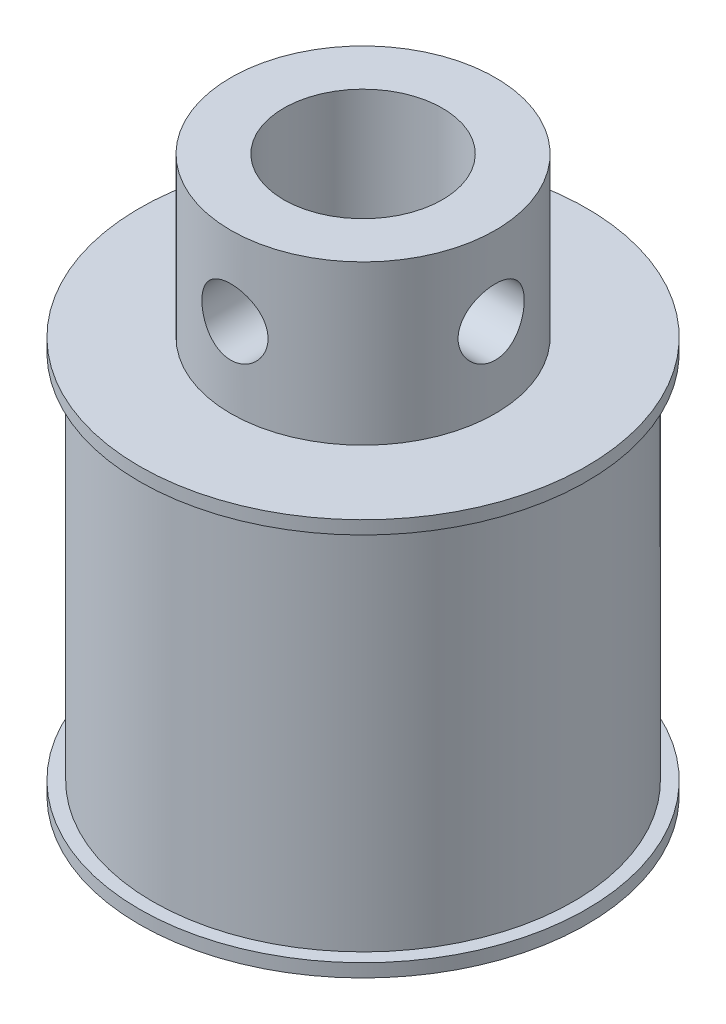
ISO-10303-21;
HEADER;
FILE_DESCRIPTION(('STEP AP214'),'2;1');
FILE_NAME('part.step','',(''),(''),'','','');
FILE_SCHEMA(('AUTOMOTIVE_DESIGN { 1 0 10303 214 1 1 1 1 }'));
ENDSEC;
DATA;
#1=APPLICATION_CONTEXT('core data for automotive mechanical design processes');
#2=APPLICATION_PROTOCOL_DEFINITION('international standard','automotive_design',2000,#1);
#3=PRODUCT_CONTEXT('',#1,'mechanical');
#4=PRODUCT('Part','Part','',(#3));
#5=PRODUCT_RELATED_PRODUCT_CATEGORY('part','',(#4));
#6=PRODUCT_DEFINITION_FORMATION('','',#4);
#7=PRODUCT_DEFINITION_CONTEXT('part definition',#1,'design');
#8=PRODUCT_DEFINITION('design','',#6,#7);
#9=PRODUCT_DEFINITION_SHAPE('','',#8);
#10=(LENGTH_UNIT() NAMED_UNIT(*) SI_UNIT(.MILLI.,.METRE.));
#11=(NAMED_UNIT(*) PLANE_ANGLE_UNIT() SI_UNIT($,.RADIAN.));
#12=(NAMED_UNIT(*) SI_UNIT($,.STERADIAN.) SOLID_ANGLE_UNIT());
#13=UNCERTAINTY_MEASURE_WITH_UNIT(LENGTH_MEASURE(1.E-05),#10,'distance_accuracy_value','');
#14=(GEOMETRIC_REPRESENTATION_CONTEXT(3) GLOBAL_UNCERTAINTY_ASSIGNED_CONTEXT((#13)) GLOBAL_UNIT_ASSIGNED_CONTEXT((#10,
#11,#12)) REPRESENTATION_CONTEXT('',''));
#15=CARTESIAN_POINT('',(0.,0.,0.));
#16=DIRECTION('',(0.,0.,1.));
#17=DIRECTION('',(1.,0.,0.));
#18=AXIS2_PLACEMENT_3D('',#15,#16,#17);
#19=CARTESIAN_POINT('',(0.,7.5,0.));
#20=DIRECTION('',(0.,-1.,0.));
#21=DIRECTION('',(0.,0.,-1.));
#22=AXIS2_PLACEMENT_3D('',#19,#20,#21);
#23=CYLINDRICAL_SURFACE('',#22,7.95);
#24=CARTESIAN_POINT('',(0.,-7.,0.));
#25=DIRECTION('',(0.,1.,0.));
#26=DIRECTION('',(0.,0.,1.));
#27=AXIS2_PLACEMENT_3D('',#24,#25,#26);
#28=CIRCLE('',#27,7.95);
#29=CARTESIAN_POINT('',(0.,-7.,7.95));
#30=VERTEX_POINT('',#29);
#31=EDGE_CURVE('E81',#30,#30,#28,.T.);
#32=ORIENTED_EDGE('',*,*,#31,.T.);
#33=EDGE_LOOP('',(#32));
#34=FACE_BOUND('',#33,.T.);
#35=CARTESIAN_POINT('',(0.,7.,0.));
#36=DIRECTION('',(0.,1.,0.));
#37=DIRECTION('',(0.,0.,1.));
#38=AXIS2_PLACEMENT_3D('',#35,#36,#37);
#39=CIRCLE('',#38,7.95);
#40=CARTESIAN_POINT('',(0.,7.,7.95));
#41=VERTEX_POINT('',#40);
#42=EDGE_CURVE('E12',#41,#41,#39,.T.);
#43=ORIENTED_EDGE('',*,*,#42,.F.);
#44=EDGE_LOOP('',(#43));
#45=FACE_BOUND('',#44,.T.);
#46=ADVANCED_FACE('F58',(#34,#45),#23,.T.);
#47=CARTESIAN_POINT('',(0.,7.,0.));
#48=DIRECTION('',(0.,1.,0.));
#49=DIRECTION('',(0.,0.,1.));
#50=AXIS2_PLACEMENT_3D('',#47,#48,#49);
#51=CYLINDRICAL_SURFACE('',#50,8.45);
#52=CARTESIAN_POINT('',(0.,7.,0.));
#53=DIRECTION('',(0.,1.,0.));
#54=DIRECTION('',(0.,0.,1.));
#55=AXIS2_PLACEMENT_3D('',#52,#53,#54);
#56=CIRCLE('',#55,8.45);
#57=CARTESIAN_POINT('',(0.,7.,8.45));
#58=VERTEX_POINT('',#57);
#59=EDGE_CURVE('E71',#58,#58,#56,.T.);
#60=ORIENTED_EDGE('',*,*,#59,.T.);
#61=EDGE_LOOP('',(#60));
#62=FACE_BOUND('',#61,.T.);
#63=CARTESIAN_POINT('',(0.,7.5,0.));
#64=DIRECTION('',(0.,1.,0.));
#65=DIRECTION('',(0.,0.,1.));
#66=AXIS2_PLACEMENT_3D('',#63,#64,#65);
#67=CIRCLE('',#66,8.45);
#68=CARTESIAN_POINT('',(0.,7.5,8.45));
#69=VERTEX_POINT('',#68);
#70=EDGE_CURVE('E78',#69,#69,#67,.T.);
#71=ORIENTED_EDGE('',*,*,#70,.F.);
#72=EDGE_LOOP('',(#71));
#73=FACE_BOUND('',#72,.T.);
#74=ADVANCED_FACE('F171',(#62,#73),#51,.T.);
#75=CARTESIAN_POINT('',(0.,7.,0.));
#76=DIRECTION('',(0.,1.,0.));
#77=DIRECTION('',(0.,0.,1.));
#78=AXIS2_PLACEMENT_3D('',#75,#76,#77);
#79=PLANE('',#78);
#80=ORIENTED_EDGE('',*,*,#42,.T.);
#81=EDGE_LOOP('',(#80));
#82=FACE_BOUND('',#81,.T.);
#83=ORIENTED_EDGE('',*,*,#59,.F.);
#84=EDGE_LOOP('',(#83));
#85=FACE_BOUND('',#84,.T.);
#86=ADVANCED_FACE('F168',(#82,#85),#79,.F.);
#87=CARTESIAN_POINT('',(0.,7.5,0.));
#88=DIRECTION('',(0.,1.,0.));
#89=DIRECTION('',(0.,0.,1.));
#90=AXIS2_PLACEMENT_3D('',#87,#88,#89);
#91=PLANE('',#90);
#92=CARTESIAN_POINT('',(0.,7.5,0.));
#93=DIRECTION('',(0.,1.,0.));
#94=DIRECTION('',(0.,0.,1.));
#95=AXIS2_PLACEMENT_3D('',#92,#93,#94);
#96=CIRCLE('',#95,5.);
#97=CARTESIAN_POINT('',(0.,7.5,5.));
#98=VERTEX_POINT('',#97);
#99=EDGE_CURVE('E99',#98,#98,#96,.F.);
#100=ORIENTED_EDGE('',*,*,#99,.T.);
#101=EDGE_LOOP('',(#100));
#102=FACE_BOUND('',#101,.T.);
#103=ORIENTED_EDGE('',*,*,#70,.T.);
#104=EDGE_LOOP('',(#103));
#105=FACE_BOUND('',#104,.T.);
#106=ADVANCED_FACE('F166',(#102,#105),#91,.T.);
#107=CARTESIAN_POINT('',(0.,-7.,0.));
#108=DIRECTION('',(0.,-1.,0.));
#109=DIRECTION('',(0.,0.,-1.));
#110=AXIS2_PLACEMENT_3D('',#107,#108,#109);
#111=CYLINDRICAL_SURFACE('',#110,8.45);
#112=CARTESIAN_POINT('',(0.,-7.,0.));
#113=DIRECTION('',(0.,1.,0.));
#114=DIRECTION('',(0.,0.,1.));
#115=AXIS2_PLACEMENT_3D('',#112,#113,#114);
#116=CIRCLE('',#115,8.45);
#117=CARTESIAN_POINT('',(0.,-7.,8.45));
#118=VERTEX_POINT('',#117);
#119=EDGE_CURVE('E84',#118,#118,#116,.T.);
#120=ORIENTED_EDGE('',*,*,#119,.F.);
#121=EDGE_LOOP('',(#120));
#122=FACE_BOUND('',#121,.T.);
#123=CARTESIAN_POINT('',(0.,-7.5,0.));
#124=DIRECTION('',(0.,1.,0.));
#125=DIRECTION('',(0.,0.,1.));
#126=AXIS2_PLACEMENT_3D('',#123,#124,#125);
#127=CIRCLE('',#126,8.45);
#128=CARTESIAN_POINT('',(0.,-7.5,8.45));
#129=VERTEX_POINT('',#128);
#130=EDGE_CURVE('E92',#129,#129,#127,.T.);
#131=ORIENTED_EDGE('',*,*,#130,.T.);
#132=EDGE_LOOP('',(#131));
#133=FACE_BOUND('',#132,.T.);
#134=ADVANCED_FACE('F162',(#122,#133),#111,.T.);
#135=CARTESIAN_POINT('',(0.,-7.,0.));
#136=DIRECTION('',(0.,1.,0.));
#137=DIRECTION('',(0.,0.,1.));
#138=AXIS2_PLACEMENT_3D('',#135,#136,#137);
#139=PLANE('',#138);
#140=ORIENTED_EDGE('',*,*,#31,.F.);
#141=EDGE_LOOP('',(#140));
#142=FACE_BOUND('',#141,.T.);
#143=ORIENTED_EDGE('',*,*,#119,.T.);
#144=EDGE_LOOP('',(#143));
#145=FACE_BOUND('',#144,.T.);
#146=ADVANCED_FACE('F159',(#142,#145),#139,.T.);
#147=CARTESIAN_POINT('',(0.,-7.5,0.));
#148=DIRECTION('',(0.,1.,0.));
#149=DIRECTION('',(0.,0.,1.));
#150=AXIS2_PLACEMENT_3D('',#147,#148,#149);
#151=PLANE('',#150);
#152=CARTESIAN_POINT('',(0.,-7.5,0.));
#153=DIRECTION('',(0.,1.,0.));
#154=DIRECTION('',(0.,0.,1.));
#155=AXIS2_PLACEMENT_3D('',#152,#153,#154);
#156=CIRCLE('',#155,3.);
#157=CARTESIAN_POINT('',(0.,-7.5,3.));
#158=VERTEX_POINT('',#157);
#159=EDGE_CURVE('E109',#158,#158,#156,.T.);
#160=ORIENTED_EDGE('',*,*,#159,.T.);
#161=EDGE_LOOP('',(#160));
#162=FACE_BOUND('',#161,.T.);
#163=ORIENTED_EDGE('',*,*,#130,.F.);
#164=EDGE_LOOP('',(#163));
#165=FACE_BOUND('',#164,.T.);
#166=ADVANCED_FACE('F157',(#162,#165),#151,.F.);
#167=CARTESIAN_POINT('',(0.,13.5,0.));
#168=DIRECTION('',(0.,-1.,0.));
#169=DIRECTION('',(0.,0.,-1.));
#170=AXIS2_PLACEMENT_3D('',#167,#168,#169);
#171=CYLINDRICAL_SURFACE('',#170,5.);
#172=CARTESIAN_POINT('',(-1.25,10.5,4.84122918275927));
#173=CARTESIAN_POINT('',(-1.24999803929589,10.5690253754623,4.84123050042654));
#174=CARTESIAN_POINT('',(-1.24426312274865,10.638072449339,4.84272153006957));
#175=CARTESIAN_POINT('',(-1.22151156273207,10.774183789087,4.84850930996624));
#176=CARTESIAN_POINT('',(-1.2044883533711,10.8412468772342,4.85280769310907));
#177=CARTESIAN_POINT('',(-1.15974559981597,10.9714017690935,4.86369362297984));
#178=CARTESIAN_POINT('',(-1.13203986392723,11.0344985776928,4.87027821345204));
#179=CARTESIAN_POINT('',(-1.0667605706307,11.15515542627,4.88499096014404));
#180=CARTESIAN_POINT('',(-1.02918659428034,11.2127152310401,4.89311918189251));
#181=CARTESIAN_POINT('',(-0.944354213655936,11.3219308226311,4.91020358177806));
#182=CARTESIAN_POINT('',(-0.896918443852023,11.373446800175,4.91917298811515));
#183=CARTESIAN_POINT('',(-0.794091032050331,11.4678806971802,4.93681437757649));
#184=CARTESIAN_POINT('',(-0.738698647090152,11.5107978128109,4.94548633283195));
#185=CARTESIAN_POINT('',(-0.620572600539475,11.5873877338156,4.96170207760291));
#186=CARTESIAN_POINT('',(-0.557747288097558,11.6209231940807,4.96922843700296));
#187=CARTESIAN_POINT('',(-0.427131592146379,11.6769048220765,4.98215405962992));
#188=CARTESIAN_POINT('',(-0.359341942895968,11.6993526259578,4.98755363667172));
#189=CARTESIAN_POINT('',(-0.222179379377079,11.7320739172893,4.9955237942409));
#190=CARTESIAN_POINT('',(-0.152866359774486,11.7425848221633,4.99814946922157));
#191=CARTESIAN_POINT('',(-0.0134144096313835,11.7518791896378,5.00046797053649));
#192=CARTESIAN_POINT('',(0.0567243972690353,11.7506643861048,5.00016123048352));
#193=CARTESIAN_POINT('',(0.194190308965485,11.7367125748749,4.99669047476767));
#194=CARTESIAN_POINT('',(0.261545269501334,11.7242318374731,4.99359001170437));
#195=CARTESIAN_POINT('',(0.393172809267108,11.6885143649758,4.98495418262427));
#196=CARTESIAN_POINT('',(0.457445224213048,11.6652770573113,4.9794186869922));
#197=CARTESIAN_POINT('',(0.581758379377258,11.6084987146565,4.96643754850448));
#198=CARTESIAN_POINT('',(0.64175563720813,11.5748664776691,4.95897509847527));
#199=CARTESIAN_POINT('',(0.75534452792561,11.4983221604419,4.94294951904824));
#200=CARTESIAN_POINT('',(0.808935043856881,11.4554084657197,4.93438619826245));
#201=CARTESIAN_POINT('',(0.909717543856194,11.3601456290088,4.9168185688476));
#202=CARTESIAN_POINT('',(0.956697098843998,11.3075725538261,4.90780859762959));
#203=CARTESIAN_POINT('',(1.04122046995377,11.1952000132299,4.89057521758353));
#204=CARTESIAN_POINT('',(1.07876384505752,11.1354002102545,4.88235184552985));
#205=CARTESIAN_POINT('',(1.14348516127825,11.0098549829255,4.86760248415824));
#206=CARTESIAN_POINT('',(1.17061195871311,10.9440821348434,4.8610849186286));
#207=CARTESIAN_POINT('',(1.21335702579542,10.8087072659618,4.85059320069978));
#208=CARTESIAN_POINT('',(1.22897775819114,10.7391060680084,4.84661850405109));
#209=CARTESIAN_POINT('',(1.24791481933259,10.6000202492384,4.8417767801957));
#210=CARTESIAN_POINT('',(1.25154523695981,10.5305811033352,4.84083044546824));
#211=CARTESIAN_POINT('',(1.24725849525777,10.3920890317109,4.8419367174052));
#212=CARTESIAN_POINT('',(1.2393423989244,10.3230360710244,4.84398904800633));
#213=CARTESIAN_POINT('',(1.21246273196883,10.1884428675226,4.8507854097728));
#214=CARTESIAN_POINT('',(1.19368203414087,10.1228636367146,4.85548485117188));
#215=CARTESIAN_POINT('',(1.14580904083531,9.99578427107416,4.86700359135481));
#216=CARTESIAN_POINT('',(1.11671552385627,9.93428462047233,4.87382314124307));
#217=CARTESIAN_POINT('',(1.04838533396828,9.81577936106633,4.88898068546631));
#218=CARTESIAN_POINT('',(1.00896087691781,9.75888557997845,4.89734584303321));
#219=CARTESIAN_POINT('',(0.921325366168068,9.65240581859933,4.91458541535858));
#220=CARTESIAN_POINT('',(0.873112868506798,9.60282104167497,4.92345991364235));
#221=CARTESIAN_POINT('',(0.767828401230906,9.51109447871453,4.94098701515803));
#222=CARTESIAN_POINT('',(0.71056494066449,9.4691699687256,4.94962851030918));
#223=CARTESIAN_POINT('',(0.589628353368343,9.39553206652438,4.96548608306867));
#224=CARTESIAN_POINT('',(0.525955561196988,9.3638181416959,4.9727022350198));
#225=CARTESIAN_POINT('',(0.394447752163861,9.31177698273604,4.98485057869157));
#226=CARTESIAN_POINT('',(0.32664672628485,9.29136785781047,4.98979915011205));
#227=CARTESIAN_POINT('',(0.188437200398509,9.26226983269579,4.99692646697894));
#228=CARTESIAN_POINT('',(0.118029206301553,9.25357867063048,4.99910574696704));
#229=CARTESIAN_POINT('',(-0.0213544080541589,9.24829051303059,5.00042711761014));
#230=CARTESIAN_POINT('',(-0.0903172837075423,9.25137286363077,4.9996497360001));
#231=CARTESIAN_POINT('',(-0.226709370518425,9.26880978411792,4.9953237057178));
#232=CARTESIAN_POINT('',(-0.294138627226109,9.28316401876638,4.99177513946369));
#233=CARTESIAN_POINT('',(-0.425213794556021,9.32256527471366,4.98231791067453));
#234=CARTESIAN_POINT('',(-0.488878118226275,9.34755431664328,4.97642205628333));
#235=CARTESIAN_POINT('',(-0.611146316301836,9.40746322377416,4.9628911114173));
#236=CARTESIAN_POINT('',(-0.669749551581315,9.44238434083696,4.9552558017217));
#237=CARTESIAN_POINT('',(-0.781752410529875,9.52214404249635,4.93884062101666));
#238=CARTESIAN_POINT('',(-0.83499373537573,9.56720017863423,4.93003771182014));
#239=CARTESIAN_POINT('',(-0.933268775339069,9.66552856496725,4.91238311316553));
#240=CARTESIAN_POINT('',(-0.978300406335237,9.71880289512239,4.90353141190695));
#241=CARTESIAN_POINT('',(-1.05970253309904,9.83325176775167,4.88659344825685));
#242=CARTESIAN_POINT('',(-1.09589577430819,9.89455515426579,4.87852454662356));
#243=CARTESIAN_POINT('',(-1.15740862076958,10.0225693624034,4.8642994443827));
#244=CARTESIAN_POINT('',(-1.18273613719965,10.0892762076334,4.85814185308378));
#245=CARTESIAN_POINT('',(-1.2180281607068,10.2132212647834,4.84939885924729));
#246=CARTESIAN_POINT('',(-1.22999146324422,10.2698664554798,4.84635828750683));
#247=CARTESIAN_POINT('',(-1.24597786571658,10.38433608625,4.84227298231965));
#248=CARTESIAN_POINT('',(-1.25000164296523,10.4421604253063,4.84122807862454));
#249=CARTESIAN_POINT('',(-1.25,10.5,4.84122918275927));
#250=B_SPLINE_CURVE_WITH_KNOTS('',3,(#172,#173,#174,#175,#176,#177,#178,#179,#180,#181,#182,
#183,#184,#185,#186,#187,#188,#189,#190,#191,#192,#193,#194,#195,#196,#197,#198,#199,#200,#201,
#202,#203,#204,#205,#206,#207,#208,#209,#210,#211,#212,#213,#214,#215,#216,#217,#218,#219,#220,
#221,#222,#223,#224,#225,#226,#227,#228,#229,#230,#231,#232,#233,#234,#235,#236,#237,#238,#239,
#240,#241,#242,#243,#244,#245,#246,#247,#248,#249),.UNSPECIFIED.,.T.,.F.,(4,2,2,2,2,2,2,2,2,2,2,
2,2,2,2,2,2,2,2,2,2,2,2,2,2,2,2,2,2,2,2,2,2,2,2,2,2,2,4),(0.,0.206863720868071,
0.413847870714333,0.620565363583009,0.827291633777393,1.03811977096488,1.24896760739933,
1.4627574819896,1.67651579923546,1.88594375497673,2.0953407433301,2.30009131344473,
2.50485278362393,2.71146437127222,2.91811192734456,3.13035233285956,3.34260265599901,
3.55588216004201,3.76911600064773,3.97671787380858,4.18430063591901,4.38848702504603,
4.59269760710708,4.80091422929578,5.00916509442522,5.22262665482659,5.43607707859776,
5.64796036403464,5.85980274454519,6.06591723063728,6.2720255868849,6.47702438279855,
6.68204902869036,6.89198548291035,7.10197515782754,7.31588238642338,7.52963360683309,
7.70298913588665,7.8763298754976),.UNSPECIFIED.);
#251=CARTESIAN_POINT('',(-1.25,10.5,4.84122918275927));
#252=VERTEX_POINT('',#251);
#253=EDGE_CURVE('E145',#252,#252,#250,.T.);
#254=ORIENTED_EDGE('',*,*,#253,.T.);
#255=EDGE_LOOP('',(#254));
#256=FACE_BOUND('',#255,.T.);
#257=CARTESIAN_POINT('',(4.84122918275927,10.5,1.24999999999999));
#258=CARTESIAN_POINT('',(4.84123050042654,10.5690253754623,1.24999803929588));
#259=CARTESIAN_POINT('',(4.84272153006957,10.638072449339,1.24426312274864));
#260=CARTESIAN_POINT('',(4.84850930996624,10.774183789087,1.22151156273206));
#261=CARTESIAN_POINT('',(4.85280769310907,10.8412468772342,1.20448835337109));
#262=CARTESIAN_POINT('',(4.86369362297984,10.9714017690935,1.15974559981597));
#263=CARTESIAN_POINT('',(4.87027821345204,11.0344985776928,1.13203986392723));
#264=CARTESIAN_POINT('',(4.88499096014404,11.15515542627,1.0667605706307));
#265=CARTESIAN_POINT('',(4.89311918189251,11.2127152310401,1.02918659428034));
#266=CARTESIAN_POINT('',(4.91020358177806,11.3219308226311,0.944354213655932));
#267=CARTESIAN_POINT('',(4.91917298811515,11.373446800175,0.89691844385202));
#268=CARTESIAN_POINT('',(4.93681437757649,11.4678806971802,0.794091032050328));
#269=CARTESIAN_POINT('',(4.94548633283195,11.5107978128109,0.738698647090149));
#270=CARTESIAN_POINT('',(4.96170207760291,11.5873877338156,0.620572600539473));
#271=CARTESIAN_POINT('',(4.96922843700296,11.6209231940807,0.557747288097556));
#272=CARTESIAN_POINT('',(4.98215405962992,11.6769048220765,0.427131592146378));
#273=CARTESIAN_POINT('',(4.98755363667172,11.6993526259578,0.359341942895968));
#274=CARTESIAN_POINT('',(4.9955237942409,11.7320739172893,0.222179379377079));
#275=CARTESIAN_POINT('',(4.99814946922157,11.7425848221633,0.152866359774486));
#276=CARTESIAN_POINT('',(5.00046797053649,11.7518791896378,0.0134144096313839));
#277=CARTESIAN_POINT('',(5.00016123048352,11.7506643861048,-0.0567243972690349));
#278=CARTESIAN_POINT('',(4.99669047476767,11.7367125748749,-0.194190308965484));
#279=CARTESIAN_POINT('',(4.99359001170437,11.7242318374731,-0.261545269501333));
#280=CARTESIAN_POINT('',(4.98495418262427,11.6885143649757,-0.393172809267106));
#281=CARTESIAN_POINT('',(4.9794186869922,11.6652770573113,-0.457445224213046));
#282=CARTESIAN_POINT('',(4.96643754850448,11.6084987146565,-0.581758379377256));
#283=CARTESIAN_POINT('',(4.95897509847527,11.5748664776691,-0.641755637208128));
#284=CARTESIAN_POINT('',(4.94294951904825,11.4983221604419,-0.755344527925608));
#285=CARTESIAN_POINT('',(4.93438619826245,11.4554084657197,-0.808935043856878));
#286=CARTESIAN_POINT('',(4.9168185688476,11.3601456290088,-0.909717543856191));
#287=CARTESIAN_POINT('',(4.90780859762959,11.3075725538261,-0.956697098843995));
#288=CARTESIAN_POINT('',(4.89057521758353,11.1952000132299,-1.04122046995377));
#289=CARTESIAN_POINT('',(4.88235184552985,11.1354002102545,-1.07876384505752));
#290=CARTESIAN_POINT('',(4.86760248415824,11.0098549829255,-1.14348516127824));
#291=CARTESIAN_POINT('',(4.8610849186286,10.9440821348434,-1.17061195871311));
#292=CARTESIAN_POINT('',(4.85059320069979,10.8087072659618,-1.21335702579542));
#293=CARTESIAN_POINT('',(4.84661850405109,10.7391060680084,-1.22897775819113));
#294=CARTESIAN_POINT('',(4.84177678019571,10.6000202492384,-1.24791481933258));
#295=CARTESIAN_POINT('',(4.84083044546824,10.5305811033352,-1.25154523695981));
#296=CARTESIAN_POINT('',(4.8419367174052,10.3920890317109,-1.24725849525777));
#297=CARTESIAN_POINT('',(4.84398904800633,10.3230360710244,-1.23934239892439));
#298=CARTESIAN_POINT('',(4.8507854097728,10.1884428675226,-1.21246273196882));
#299=CARTESIAN_POINT('',(4.85548485117188,10.1228636367146,-1.19368203414087));
#300=CARTESIAN_POINT('',(4.86700359135481,9.99578427107416,-1.1458090408353));
#301=CARTESIAN_POINT('',(4.87382314124307,9.93428462047234,-1.11671552385627));
#302=CARTESIAN_POINT('',(4.88898068546631,9.81577936106633,-1.04838533396827));
#303=CARTESIAN_POINT('',(4.89734584303321,9.75888557997846,-1.00896087691781));
#304=CARTESIAN_POINT('',(4.91458541535858,9.65240581859933,-0.921325366168064));
#305=CARTESIAN_POINT('',(4.92345991364235,9.60282104167497,-0.873112868506794));
#306=CARTESIAN_POINT('',(4.94098701515803,9.51109447871453,-0.767828401230902));
#307=CARTESIAN_POINT('',(4.94962851030918,9.4691699687256,-0.710564940664486));
#308=CARTESIAN_POINT('',(4.96548608306867,9.39553206652439,-0.58962835336834));
#309=CARTESIAN_POINT('',(4.9727022350198,9.3638181416959,-0.525955561196985));
#310=CARTESIAN_POINT('',(4.98485057869157,9.31177698273604,-0.39444775216386));
#311=CARTESIAN_POINT('',(4.98979915011205,9.29136785781048,-0.326646726284849));
#312=CARTESIAN_POINT('',(4.99692646697894,9.2622698326958,-0.188437200398508));
#313=CARTESIAN_POINT('',(4.99910574696704,9.25357867063048,-0.118029206301553));
#314=CARTESIAN_POINT('',(5.00042711761014,9.24829051303059,0.0213544080541585));
#315=CARTESIAN_POINT('',(4.9996497360001,9.25137286363077,0.0903172837075417));
#316=CARTESIAN_POINT('',(4.9953237057178,9.26880978411793,0.226709370518424));
#317=CARTESIAN_POINT('',(4.99177513946369,9.28316401876639,0.294138627226108));
#318=CARTESIAN_POINT('',(4.98231791067453,9.32256527471367,0.425213794556019));
#319=CARTESIAN_POINT('',(4.97642205628333,9.34755431664329,0.488878118226272));
#320=CARTESIAN_POINT('',(4.9628911114173,9.40746322377417,0.611146316301833));
#321=CARTESIAN_POINT('',(4.9552558017217,9.44238434083697,0.669749551581312));
#322=CARTESIAN_POINT('',(4.93884062101666,9.52214404249635,0.781752410529871));
#323=CARTESIAN_POINT('',(4.93003771182014,9.56720017863423,0.834993735375726));
#324=CARTESIAN_POINT('',(4.91238311316553,9.66552856496726,0.933268775339064));
#325=CARTESIAN_POINT('',(4.90353141190695,9.71880289512239,0.978300406335232));
#326=CARTESIAN_POINT('',(4.88659344825685,9.83325176775167,1.05970253309903));
#327=CARTESIAN_POINT('',(4.87852454662356,9.89455515426579,1.09589577430818));
#328=CARTESIAN_POINT('',(4.8642994443827,10.0225693624034,1.15740862076958));
#329=CARTESIAN_POINT('',(4.85814185308379,10.0892762076334,1.18273613719964));
#330=CARTESIAN_POINT('',(4.84939885924729,10.2132212647834,1.21802816070679));
#331=CARTESIAN_POINT('',(4.84635828750684,10.2698664554798,1.22999146324422));
#332=CARTESIAN_POINT('',(4.84227298231965,10.38433608625,1.24597786571658));
#333=CARTESIAN_POINT('',(4.84122807862454,10.4421604253063,1.25000164296522));
#334=CARTESIAN_POINT('',(4.84122918275927,10.5,1.24999999999999));
#335=B_SPLINE_CURVE_WITH_KNOTS('',3,(#257,#258,#259,#260,#261,#262,#263,#264,#265,#266,#267,
#268,#269,#270,#271,#272,#273,#274,#275,#276,#277,#278,#279,#280,#281,#282,#283,#284,#285,#286,
#287,#288,#289,#290,#291,#292,#293,#294,#295,#296,#297,#298,#299,#300,#301,#302,#303,#304,#305,
#306,#307,#308,#309,#310,#311,#312,#313,#314,#315,#316,#317,#318,#319,#320,#321,#322,#323,#324,
#325,#326,#327,#328,#329,#330,#331,#332,#333,#334),.UNSPECIFIED.,.T.,.F.,(4,2,2,2,2,2,2,2,2,2,2,
2,2,2,2,2,2,2,2,2,2,2,2,2,2,2,2,2,2,2,2,2,2,2,2,2,2,2,4),(0.,0.206863720868068,
0.413847870714331,0.620565363583005,0.827291633777387,1.03811977096488,1.24896760739933,
1.46275748198959,1.67651579923545,1.88594375497672,2.09534074333009,2.30009131344472,
2.50485278362392,2.71146437127221,2.91811192734455,3.13035233285954,3.34260265599899,
3.55588216004199,3.76911600064772,3.97671787380856,4.18430063591899,4.38848702504601,
4.59269760710706,4.80091422929576,5.0091650944252,5.22262665482657,5.43607707859774,
5.64796036403462,5.85980274454516,6.06591723063725,6.27202558688487,6.47702438279852,
6.68204902869033,6.89198548291032,7.10197515782751,7.31588238642335,7.52963360683306,
7.70298913588661,7.87632987549756),.UNSPECIFIED.);
#336=CARTESIAN_POINT('',(4.84122918275927,10.5,1.24999999999999));
#337=VERTEX_POINT('',#336);
#338=EDGE_CURVE('E125',#337,#337,#335,.T.);
#339=ORIENTED_EDGE('',*,*,#338,.T.);
#340=EDGE_LOOP('',(#339));
#341=FACE_BOUND('',#340,.T.);
#342=ORIENTED_EDGE('',*,*,#99,.F.);
#343=EDGE_LOOP('',(#342));
#344=FACE_BOUND('',#343,.T.);
#345=CARTESIAN_POINT('',(0.,13.5,0.));
#346=DIRECTION('',(0.,1.,0.));
#347=DIRECTION('',(0.,0.,1.));
#348=AXIS2_PLACEMENT_3D('',#345,#346,#347);
#349=CIRCLE('',#348,5.);
#350=CARTESIAN_POINT('',(0.,13.5,5.));
#351=VERTEX_POINT('',#350);
#352=EDGE_CURVE('E105',#351,#351,#349,.T.);
#353=ORIENTED_EDGE('',*,*,#352,.F.);
#354=EDGE_LOOP('',(#353));
#355=FACE_BOUND('',#354,.T.);
#356=ADVANCED_FACE('F152',(#256,#341,#344,#355),#171,.T.);
#357=CARTESIAN_POINT('',(0.,13.5,0.));
#358=DIRECTION('',(0.,1.,0.));
#359=DIRECTION('',(0.,0.,1.));
#360=AXIS2_PLACEMENT_3D('',#357,#358,#359);
#361=PLANE('',#360);
#362=CARTESIAN_POINT('',(0.,13.5,0.));
#363=DIRECTION('',(0.,1.,0.));
#364=DIRECTION('',(0.,0.,1.));
#365=AXIS2_PLACEMENT_3D('',#362,#363,#364);
#366=CIRCLE('',#365,3.);
#367=CARTESIAN_POINT('',(0.,13.5,3.));
#368=VERTEX_POINT('',#367);
#369=EDGE_CURVE('E113',#368,#368,#366,.T.);
#370=ORIENTED_EDGE('',*,*,#369,.F.);
#371=EDGE_LOOP('',(#370));
#372=FACE_BOUND('',#371,.T.);
#373=ORIENTED_EDGE('',*,*,#352,.T.);
#374=EDGE_LOOP('',(#373));
#375=FACE_BOUND('',#374,.T.);
#376=ADVANCED_FACE('F156',(#372,#375),#361,.T.);
#377=CARTESIAN_POINT('',(0.,-7.5,0.));
#378=DIRECTION('',(0.,1.,0.));
#379=DIRECTION('',(0.,0.,1.));
#380=AXIS2_PLACEMENT_3D('',#377,#378,#379);
#381=CYLINDRICAL_SURFACE('',#380,3.);
#382=CARTESIAN_POINT('',(0.,9.25,3.));
#383=CARTESIAN_POINT('',(0.0669580526362668,9.2500072050913,2.99999458367273));
#384=CARTESIAN_POINT('',(0.134021397063841,9.25541195852814,2.9977323297471));
#385=CARTESIAN_POINT('',(0.266247371156347,9.27683906492018,2.98890153579552));
#386=CARTESIAN_POINT('',(0.331404576423564,9.29288912446425,2.98232175901028));
#387=CARTESIAN_POINT('',(0.457688733653087,9.33491109178059,2.96556289038127));
#388=CARTESIAN_POINT('',(0.518828524426269,9.36084938946815,2.95539599975004));
#389=CARTESIAN_POINT('',(0.635829756679802,9.42177282323257,2.93245286470664));
#390=CARTESIAN_POINT('',(0.691692790015939,9.45675521897087,2.91967741092849));
#391=CARTESIAN_POINT('',(0.799448403559511,9.53662898259088,2.89207828351869));
#392=CARTESIAN_POINT('',(0.851041267517768,9.58190130878975,2.87718753326093));
#393=CARTESIAN_POINT('',(0.946159821091262,9.68026433478257,2.84732714068514));
#394=CARTESIAN_POINT('',(0.989681263153085,9.73335912489451,2.83235746106809));
#395=CARTESIAN_POINT('',(1.06953737697065,9.8490267775649,2.80321021812995));
#396=CARTESIAN_POINT('',(1.10541308153925,9.91193744842655,2.78910786873385));
#397=CARTESIAN_POINT('',(1.16593940588866,10.0435732579209,2.76435572357005));
#398=CARTESIAN_POINT('',(1.19059580836291,10.1122953794845,2.75370415000823));
#399=CARTESIAN_POINT('',(1.22674598312159,10.2501536917679,2.73778555387705));
#400=CARTESIAN_POINT('',(1.23881657877606,10.3191104833922,2.73228387651787));
#401=CARTESIAN_POINT('',(1.25125209967796,10.4582732926866,2.72661326219504));
#402=CARTESIAN_POINT('',(1.25162348054397,10.5284786000257,2.7264413842526));
#403=CARTESIAN_POINT('',(1.24108450363674,10.6624000604349,2.73125119560853));
#404=CARTESIAN_POINT('',(1.23103681112301,10.7262010965645,2.73583882723623));
#405=CARTESIAN_POINT('',(1.20139191015777,10.8511120910004,2.74898482773796));
#406=CARTESIAN_POINT('',(1.18179287287177,10.9122215314918,2.75754395703564));
#407=CARTESIAN_POINT('',(1.13321958727571,11.0315577029914,2.77786184772757));
#408=CARTESIAN_POINT('',(1.10405471539236,11.0896954209134,2.78968481949136));
#409=CARTESIAN_POINT('',(1.03731242580562,11.2004777338801,2.81518331141086));
#410=CARTESIAN_POINT('',(0.999731690519544,11.2531201506135,2.82885956129779));
#411=CARTESIAN_POINT('',(0.913495965543836,11.3560999587328,2.85792976877979));
#412=CARTESIAN_POINT('',(0.864173483207527,11.4058665673854,2.87337121404473));
#413=CARTESIAN_POINT('',(0.757729591051513,11.4966135029592,2.90325673112529));
#414=CARTESIAN_POINT('',(0.700606359448457,11.5375917716922,2.9177005687701));
#415=CARTESIAN_POINT('',(0.578447948693378,11.6104358236163,2.94438283556473));
#416=CARTESIAN_POINT('',(0.513260582447682,11.6420694451507,2.95656266543334));
#417=CARTESIAN_POINT('',(0.377852402526835,11.6937211396033,2.97689481414803));
#418=CARTESIAN_POINT('',(0.307634394795038,11.7137456319438,2.985049358458));
#419=CARTESIAN_POINT('',(0.168928113346231,11.7404159921266,2.99599641186385));
#420=CARTESIAN_POINT('',(0.100611285278642,11.7478278574438,2.99909541047125));
#421=CARTESIAN_POINT('',(-0.036354655496087,11.7513462236141,3.00056050368745));
#422=CARTESIAN_POINT('',(-0.105003667152634,11.747455970252,2.99892795711939));
#423=CARTESIAN_POINT('',(-0.237098242341433,11.7290289151939,2.9913121765694));
#424=CARTESIAN_POINT('',(-0.300632966639384,11.7150300459028,2.9855488728399));
#425=CARTESIAN_POINT('',(-0.424382748971089,11.6775318054592,2.97048606772414));
#426=CARTESIAN_POINT('',(-0.484597386518359,11.6540312340497,2.96118611959704));
#427=CARTESIAN_POINT('',(-0.602108999869135,11.5974290242879,2.93958270645166));
#428=CARTESIAN_POINT('',(-0.659257236855323,11.564051816854,2.92719491469281));
#429=CARTESIAN_POINT('',(-0.767346216231428,11.4889466222083,2.9007380457909));
#430=CARTESIAN_POINT('',(-0.81828435260194,11.4472151484707,2.88666826768733));
#431=CARTESIAN_POINT('',(-0.916333430274263,11.3530967667276,2.85712087895438));
#432=CARTESIAN_POINT('',(-0.962910697979835,11.3001614970137,2.84161451591029));
#433=CARTESIAN_POINT('',(-1.04666984610551,11.1869787240646,2.81184336768005));
#434=CARTESIAN_POINT('',(-1.08384959285617,11.1267295648283,2.79757886493439));
#435=CARTESIAN_POINT('',(-1.14815960208699,10.9993858246974,2.77181386243988));
#436=CARTESIAN_POINT('',(-1.17513918237329,10.9322059644852,2.76035562555112));
#437=CARTESIAN_POINT('',(-1.21717413951573,10.7936294061899,2.74208355658957));
#438=CARTESIAN_POINT('',(-1.23223934863687,10.7222362375167,2.73526589555752));
#439=CARTESIAN_POINT('',(-1.24904080348901,10.5831813008008,2.72763164537264));
#440=CARTESIAN_POINT('',(-1.25171380413129,10.5156553377074,2.72639350967163));
#441=CARTESIAN_POINT('',(-1.24615575523912,10.3811571388589,2.72893853011024));
#442=CARTESIAN_POINT('',(-1.23792637964721,10.3141848196863,2.73272091540306));
#443=CARTESIAN_POINT('',(-1.21158404780491,10.1859072525311,2.74449551302268));
#444=CARTESIAN_POINT('',(-1.19394903571466,10.1244833265366,2.7522835484648));
#445=CARTESIAN_POINT('',(-1.14976328202135,10.0054519786428,2.77103181199189));
#446=CARTESIAN_POINT('',(-1.12321003517252,9.94784563460122,2.78199293131693));
#447=CARTESIAN_POINT('',(-1.0601028593549,9.83430410405088,2.80666954560013));
#448=CARTESIAN_POINT('',(-1.02304360910483,9.77867766983172,2.82051102713679));
#449=CARTESIAN_POINT('',(-0.940684072630392,9.67413986063932,2.84903689053839));
#450=CARTESIAN_POINT('',(-0.89538092890562,9.62523082439943,2.86372156345875));
#451=CARTESIAN_POINT('',(-0.793902045778822,9.53185131831526,2.89356392850106));
#452=CARTESIAN_POINT('',(-0.737174739949029,9.48796356715935,2.90867817511792));
#453=CARTESIAN_POINT('',(-0.6166000792532,9.41030054645638,2.9366014362202));
#454=CARTESIAN_POINT('',(-0.552749497945747,9.37652988511045,2.9494093991674));
#455=CARTESIAN_POINT('',(-0.420732056717952,9.32079015456012,2.97109183362461));
#456=CARTESIAN_POINT('',(-0.352653990980637,9.2986352333827,2.98002782581964));
#457=CARTESIAN_POINT('',(-0.21341042184656,9.26629367092217,2.99321009768625));
#458=CARTESIAN_POINT('',(-0.142255316980959,9.25606955747012,2.99747105811967));
#459=CARTESIAN_POINT('',(-0.0472360819191843,9.25066683891356,2.99972287568934));
#460=CARTESIAN_POINT('',(-0.0236245946756576,9.24999745785078,3.00000191102536));
#461=CARTESIAN_POINT('',(0.,9.25,3.));
#462=B_SPLINE_CURVE_WITH_KNOTS('',3,(#382,#383,#384,#385,#386,#387,#388,#389,#390,#391,#392,
#393,#394,#395,#396,#397,#398,#399,#400,#401,#402,#403,#404,#405,#406,#407,#408,#409,#410,#411,
#412,#413,#414,#415,#416,#417,#418,#419,#420,#421,#422,#423,#424,#425,#426,#427,#428,#429,#430,
#431,#432,#433,#434,#435,#436,#437,#438,#439,#440,#441,#442,#443,#444,#445,#446,#447,#448,#449,
#450,#451,#452,#453,#454,#455,#456,#457,#458,#459,#460,#461),.UNSPECIFIED.,.T.,.F.,(4,2,2,2,2,2,
2,2,2,2,2,2,2,2,2,2,2,2,2,2,2,2,2,2,2,2,2,2,2,2,2,2,2,2,2,2,2,2,2,4),(0.,0.200806918883938,
0.402138540628696,0.602791851906301,0.803384436852974,1.01317936288807,1.22308438131465,
1.44331724539125,1.66343646730588,1.87295273137557,2.08235338249046,2.27570157202556,
2.46908679727213,2.66658713058714,2.86416545717206,3.07844141127896,3.29276749314588,
3.51204055060813,3.73119224218297,3.93648443393251,4.14171767493171,4.33676589735721,
4.53183876601785,4.73297135272161,4.93418805469496,5.14978488029294,5.36543061240341,
5.58414788359523,5.8026844707458,6.00439877559644,6.20608211297536,6.39837649964762,
6.59072494950612,6.79463893397441,6.99862373425944,7.21746535004889,7.43640649428582,
7.65172855819385,7.86637250469321,7.93722256499098),.UNSPECIFIED.);
#463=CARTESIAN_POINT('',(0.,9.25,3.));
#464=VERTEX_POINT('',#463);
#465=EDGE_CURVE('E61',#464,#464,#462,.T.);
#466=ORIENTED_EDGE('',*,*,#465,.T.);
#467=EDGE_LOOP('',(#466));
#468=FACE_BOUND('',#467,.T.);
#469=CARTESIAN_POINT('',(2.72717802865893,10.5,1.24999999999999));
#470=CARTESIAN_POINT('',(2.7271851956322,10.4333281091031,1.24999259066567));
#471=CARTESIAN_POINT('',(2.72965859534401,10.3665473431738,1.24463203881502));
#472=CARTESIAN_POINT('',(2.73923833650884,10.2349130579429,1.22339678947784));
#473=CARTESIAN_POINT('',(2.74635725824267,10.1700652733248,1.20749354003276));
#474=CARTESIAN_POINT('',(2.76426917574768,10.0444388703089,1.1658998841945));
#475=CARTESIAN_POINT('',(2.77504717562616,9.98364483628499,1.14024937431427));
#476=CARTESIAN_POINT('',(2.79904148565793,9.86724055042195,1.08000637754462));
#477=CARTESIAN_POINT('',(2.81225721880783,9.81162907656689,1.04541600591531));
#478=CARTESIAN_POINT('',(2.84055762619857,9.70367427502654,0.965973882676161));
#479=CARTESIAN_POINT('',(2.85570568079146,9.65169244125591,0.920653238184402));
#480=CARTESIAN_POINT('',(2.88564295372227,9.55579977750245,0.822021675745544));
#481=CARTESIAN_POINT('',(2.90043203180789,9.51189205938699,0.768707691374));
#482=CARTESIAN_POINT('',(2.92875537930613,9.43155046912073,0.652763393797345));
#483=CARTESIAN_POINT('',(2.94220739975291,9.39552337196766,0.589829293683656));
#484=CARTESIAN_POINT('',(2.96556519993426,9.3347239794944,0.45813202236235));
#485=CARTESIAN_POINT('',(2.97547255347157,9.30994668803579,0.389371454872122));
#486=CARTESIAN_POINT('',(2.99017521042367,9.27366054124327,0.251768498025164));
#487=CARTESIAN_POINT('',(2.99520971127466,9.26152830509796,0.183116576196079));
#488=CARTESIAN_POINT('',(3.00046828611204,9.24886235884015,0.044579180365006));
#489=CARTESIAN_POINT('',(3.00069431131015,9.24832394411705,-0.0253057817645161));
#490=CARTESIAN_POINT('',(2.99645129133057,9.25853428093333,-0.159792780112567));
#491=CARTESIAN_POINT('',(2.99226714648664,9.26859810052574,-0.224457488607312));
#492=CARTESIAN_POINT('',(2.98006516750309,9.29855310263817,-0.351082893931455));
#493=CARTESIAN_POINT('',(2.97204705074577,9.31844500963017,-0.413043391054914));
#494=CARTESIAN_POINT('',(2.95279852414029,9.36772804089465,-0.533638118077524));
#495=CARTESIAN_POINT('',(2.94152097126085,9.39725946287083,-0.592207177074904));
#496=CARTESIAN_POINT('',(2.91685713989805,9.46484575670035,-0.70371176728196));
#497=CARTESIAN_POINT('',(2.90347011666255,9.50290364084499,-0.756645297756971));
#498=CARTESIAN_POINT('',(2.87481698777061,9.58958242040462,-0.859340911707919));
#499=CARTESIAN_POINT('',(2.8594849435601,9.63875879127901,-0.908616437316235));
#500=CARTESIAN_POINT('',(2.8293786068147,9.74471144070658,-0.998431414927663));
#501=CARTESIAN_POINT('',(2.8146045313137,9.8014906382921,-1.03896749582431));
#502=CARTESIAN_POINT('',(2.78681612355339,9.92339503666192,-1.11140189250063));
#503=CARTESIAN_POINT('',(2.77387558556715,9.98873320574329,-1.1429725335554));
#504=CARTESIAN_POINT('',(2.75209844221011,10.1244810449745,-1.19446432058391));
#505=CARTESIAN_POINT('',(2.74325890334594,10.1948870482695,-1.21439379627312));
#506=CARTESIAN_POINT('',(2.73141212519724,10.333896808914,-1.24080025168121));
#507=CARTESIAN_POINT('',(2.72806369197117,10.4023211222591,-1.24806614632865));
#508=CARTESIAN_POINT('',(2.72660286810642,10.5394784824115,-1.25125630518998));
#509=CARTESIAN_POINT('',(2.72848866599319,10.6082114141917,-1.24718449318148));
#510=CARTESIAN_POINT('',(2.73693131345749,10.7393983854304,-1.22853477565555));
#511=CARTESIAN_POINT('',(2.74318138016618,10.8019726867868,-1.21464618818048));
#512=CARTESIAN_POINT('',(2.75925630297447,10.9238512964979,-1.17767058564225));
#513=CARTESIAN_POINT('',(2.76908199460161,10.9831548368307,-1.15458142053124));
#514=CARTESIAN_POINT('',(2.79170797857,11.0996153103565,-1.09877520805186));
#515=CARTESIAN_POINT('',(2.80461662202282,11.1565749746103,-1.06569183306197));
#516=CARTESIAN_POINT('',(2.83180003740794,11.264408052499,-0.991200784385964));
#517=CARTESIAN_POINT('',(2.84607539920583,11.3152788167019,-0.949789507875981));
#518=CARTESIAN_POINT('',(2.87578619784533,11.413800134884,-0.8558444557155));
#519=CARTESIAN_POINT('',(2.89122146708842,11.4608513999507,-0.802679661479733));
#520=CARTESIAN_POINT('',(2.92043361183923,11.5454722919793,-0.688851512553534));
#521=CARTESIAN_POINT('',(2.93421036577014,11.5830412240637,-0.628187608803652));
#522=CARTESIAN_POINT('',(2.9586425158565,11.6475898754436,-0.50065468080338));
#523=CARTESIAN_POINT('',(2.96928983138826,11.6745422412895,-0.433770169638503));
#524=CARTESIAN_POINT('',(2.98618173103366,11.7166167923344,-0.295858835154413));
#525=CARTESIAN_POINT('',(2.9924289351992,11.7317460182261,-0.224834504225192));
#526=CARTESIAN_POINT('',(2.9995153479751,11.7488581255203,-0.0860165335064088));
#527=CARTESIAN_POINT('',(3.00070204534225,11.751685999697,-0.018344084793896));
#528=CARTESIAN_POINT('',(2.99849523480953,11.7463868587061,0.116486811714286));
#529=CARTESIAN_POINT('',(2.99510252984313,11.7382617639871,0.183645347541156));
#530=CARTESIAN_POINT('',(2.98430065981734,11.7118939278413,0.313086482449184));
#531=CARTESIAN_POINT('',(2.97703824209233,11.6940203195304,0.375457537843569));
#532=CARTESIAN_POINT('',(2.95929499847058,11.6490657527909,0.49629223050133));
#533=CARTESIAN_POINT('',(2.94881356124207,11.6219830453351,0.554755122985826));
#534=CARTESIAN_POINT('',(2.92505825398663,11.5580104707855,0.66902456547878));
#535=CARTESIAN_POINT('',(2.91167959188766,11.520732698576,0.724591657976681));
#536=CARTESIAN_POINT('',(2.88371561874231,11.4379928171281,0.82891867563878));
#537=CARTESIAN_POINT('',(2.86912986083797,11.3925276695932,0.87767606178604));
#538=CARTESIAN_POINT('',(2.83914845259141,11.2910551741456,0.970449787231577));
#539=CARTESIAN_POINT('',(2.82376522857896,11.2345409853789,1.01391775364847));
#540=CARTESIAN_POINT('',(2.79495552690186,11.1145412593198,1.09083332306674));
#541=CARTESIAN_POINT('',(2.78153014522558,11.0510518519419,1.12427532456754));
#542=CARTESIAN_POINT('',(2.75842557732643,10.9190561649772,1.17982766043577));
#543=CARTESIAN_POINT('',(2.74872654469865,10.8505788412068,1.20199823632853));
#544=CARTESIAN_POINT('',(2.73440803066668,10.7104604261493,1.234235564538));
#545=CARTESIAN_POINT('',(2.72977151604981,10.6388307927257,1.24434291521209));
#546=CARTESIAN_POINT('',(2.72744979732688,10.5446414757381,1.24940464923649));
#547=CARTESIAN_POINT('',(2.72717562860875,10.522326842612,1.25000248121118));
#548=CARTESIAN_POINT('',(2.72717802865893,10.5,1.24999999999999));
#549=B_SPLINE_CURVE_WITH_KNOTS('',3,(#469,#470,#471,#472,#473,#474,#475,#476,#477,#478,#479,
#480,#481,#482,#483,#484,#485,#486,#487,#488,#489,#490,#491,#492,#493,#494,#495,#496,#497,#498,
#499,#500,#501,#502,#503,#504,#505,#506,#507,#508,#509,#510,#511,#512,#513,#514,#515,#516,#517,
#518,#519,#520,#521,#522,#523,#524,#525,#526,#527,#528,#529,#530,#531,#532,#533,#534,#535,#536,
#537,#538,#539,#540,#541,#542,#543,#544,#545,#546,#547,#548),.UNSPECIFIED.,.T.,.F.,(4,2,2,2,2,2,
2,2,2,2,2,2,2,2,2,2,2,2,2,2,2,2,2,2,2,2,2,2,2,2,2,2,2,2,2,2,2,2,2,4),(0.,0.199951711985513,
0.400447161842174,0.600130652152111,0.799766938550096,1.01066841430654,1.2216510045991,
1.44178476577923,1.6618206677489,1.87040605977951,2.07890680917929,2.27471840245092,
2.47054443201882,2.66935814640064,2.86824221022483,3.08114531844483,3.29413040441365,
3.5141154566672,3.73394290745567,3.93950778306306,4.14500152518447,4.3373390106619,
4.52972146913528,4.73025126818167,4.93086800795463,5.14781662735511,5.36478114041864,
5.58230105955592,5.79969134643005,6.00188635094051,6.20404590801911,6.39903415036485,
6.5940594463217,6.79789862829034,7.00181361048901,7.21960426908074,7.43751638139185,
7.65425125796861,7.87025464546159,7.93721375436702),.UNSPECIFIED.);
#550=CARTESIAN_POINT('',(2.72717802865893,10.5,1.24999999999999));
#551=VERTEX_POINT('',#550);
#552=EDGE_CURVE('E117',#551,#551,#549,.T.);
#553=ORIENTED_EDGE('',*,*,#552,.T.);
#554=EDGE_LOOP('',(#553));
#555=FACE_BOUND('',#554,.T.);
#556=ORIENTED_EDGE('',*,*,#159,.F.);
#557=EDGE_LOOP('',(#556));
#558=FACE_BOUND('',#557,.T.);
#559=ORIENTED_EDGE('',*,*,#369,.T.);
#560=EDGE_LOOP('',(#559));
#561=FACE_BOUND('',#560,.T.);
#562=ADVANCED_FACE('F131',(#468,#555,#558,#561),#381,.F.);
#563=CARTESIAN_POINT('',(0.,10.5,0.));
#564=DIRECTION('',(-1.,0.,0.));
#565=DIRECTION('',(0.,0.,1.));
#566=AXIS2_PLACEMENT_3D('',#563,#564,#565);
#567=CYLINDRICAL_SURFACE('',#566,1.24999999999999);
#568=ORIENTED_EDGE('',*,*,#338,.F.);
#569=EDGE_LOOP('',(#568));
#570=FACE_BOUND('',#569,.T.);
#571=ORIENTED_EDGE('',*,*,#552,.F.);
#572=EDGE_LOOP('',(#571));
#573=FACE_BOUND('',#572,.T.);
#574=ADVANCED_FACE('F134',(#570,#573),#567,.F.);
#575=CARTESIAN_POINT('',(0.,10.5,0.));
#576=DIRECTION('',(0.,0.,-1.));
#577=DIRECTION('',(-1.,0.,0.));
#578=AXIS2_PLACEMENT_3D('',#575,#576,#577);
#579=CYLINDRICAL_SURFACE('',#578,1.25);
#580=ORIENTED_EDGE('',*,*,#465,.F.);
#581=EDGE_LOOP('',(#580));
#582=FACE_BOUND('',#581,.T.);
#583=ORIENTED_EDGE('',*,*,#253,.F.);
#584=EDGE_LOOP('',(#583));
#585=FACE_BOUND('',#584,.T.);
#586=ADVANCED_FACE('F137',(#582,#585),#579,.F.);
#587=CLOSED_SHELL('',(#46,#74,#86,#106,#134,#146,#166,#356,#376,#562,#574,#586));
#588=MANIFOLD_SOLID_BREP('B2',#587);
#589=ADVANCED_BREP_SHAPE_REPRESENTATION('',(#18,#588),#14);
#590=SHAPE_DEFINITION_REPRESENTATION(#9,#589);
ENDSEC;
END-ISO-10303-21;
